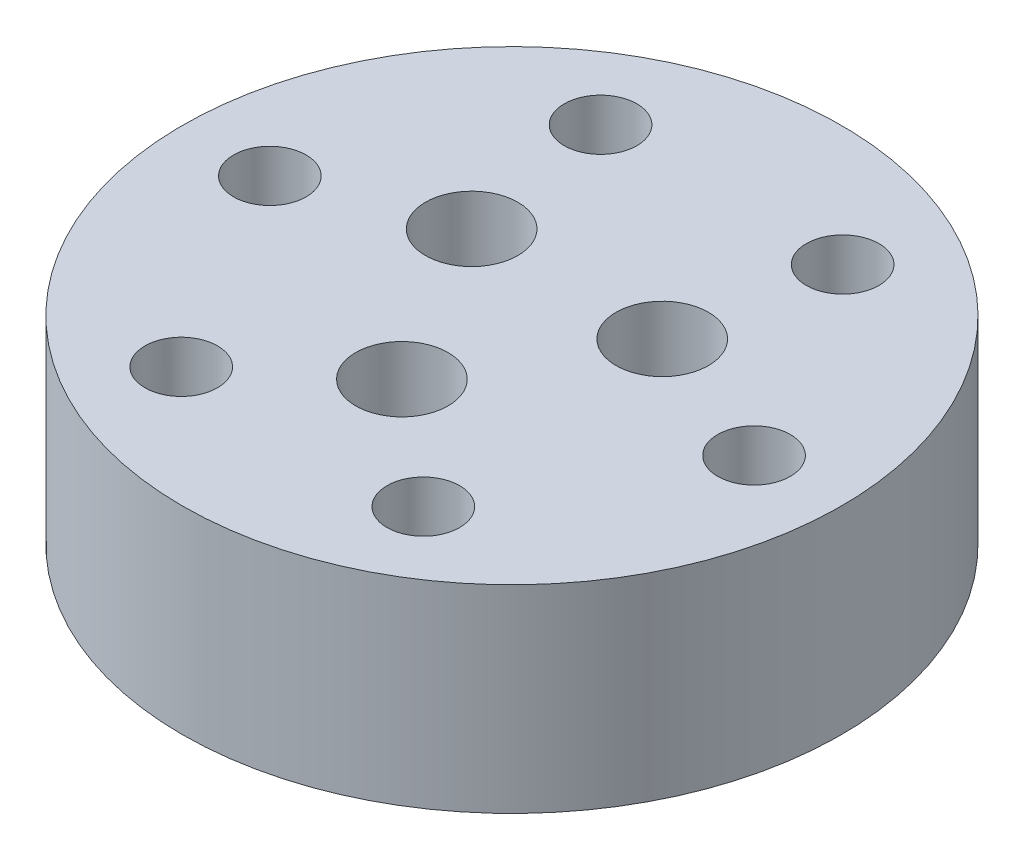
ISO-10303-21;
HEADER;
FILE_DESCRIPTION(('STEP AP214'),'2;1');
FILE_NAME('part.step','',(''),(''),'','','');
FILE_SCHEMA(('AUTOMOTIVE_DESIGN { 1 0 10303 214 1 1 1 1 }'));
ENDSEC;
DATA;
#1=APPLICATION_CONTEXT('core data for automotive mechanical design processes');
#2=APPLICATION_PROTOCOL_DEFINITION('international standard','automotive_design',2000,#1);
#3=PRODUCT_CONTEXT('',#1,'mechanical');
#4=PRODUCT('Part','Part','',(#3));
#5=PRODUCT_RELATED_PRODUCT_CATEGORY('part','',(#4));
#6=PRODUCT_DEFINITION_FORMATION('','',#4);
#7=PRODUCT_DEFINITION_CONTEXT('part definition',#1,'design');
#8=PRODUCT_DEFINITION('design','',#6,#7);
#9=PRODUCT_DEFINITION_SHAPE('','',#8);
#10=(LENGTH_UNIT() NAMED_UNIT(*) SI_UNIT(.MILLI.,.METRE.));
#11=(NAMED_UNIT(*) PLANE_ANGLE_UNIT() SI_UNIT($,.RADIAN.));
#12=(NAMED_UNIT(*) SI_UNIT($,.STERADIAN.) SOLID_ANGLE_UNIT());
#13=UNCERTAINTY_MEASURE_WITH_UNIT(LENGTH_MEASURE(1.E-05),#10,'distance_accuracy_value','');
#14=(GEOMETRIC_REPRESENTATION_CONTEXT(3) GLOBAL_UNCERTAINTY_ASSIGNED_CONTEXT((#13)) GLOBAL_UNIT_ASSIGNED_CONTEXT((#10,
#11,#12)) REPRESENTATION_CONTEXT('',''));
#15=CARTESIAN_POINT('',(0.,0.,0.));
#16=DIRECTION('',(0.,0.,1.));
#17=DIRECTION('',(1.,0.,0.));
#18=AXIS2_PLACEMENT_3D('',#15,#16,#17);
#19=CARTESIAN_POINT('',(-4.33012701892219,9.,-2.5));
#20=DIRECTION('',(0.,-1.,0.));
#21=DIRECTION('',(0.,0.,-1.));
#22=AXIS2_PLACEMENT_3D('',#19,#20,#21);
#23=CYLINDRICAL_SURFACE('',#22,2.1);
#24=CARTESIAN_POINT('',(-4.33012701892219,9.,-2.5));
#25=DIRECTION('',(0.,-1.,0.));
#26=DIRECTION('',(0.,0.,-1.));
#27=AXIS2_PLACEMENT_3D('',#24,#25,#26);
#28=CIRCLE('',#27,2.1);
#29=CARTESIAN_POINT('',(-4.33012701892219,9.,-4.6));
#30=VERTEX_POINT('',#29);
#31=EDGE_CURVE('E76',#30,#30,#28,.T.);
#32=ORIENTED_EDGE('',*,*,#31,.F.);
#33=EDGE_LOOP('',(#32));
#34=FACE_BOUND('',#33,.T.);
#35=CARTESIAN_POINT('',(-4.33012701892219,4.,-2.5));
#36=DIRECTION('',(0.,-1.,0.));
#37=DIRECTION('',(0.,0.,-1.));
#38=AXIS2_PLACEMENT_3D('',#35,#36,#37);
#39=CIRCLE('',#38,2.1);
#40=CARTESIAN_POINT('',(-4.33012701892219,4.,-4.6));
#41=VERTEX_POINT('',#40);
#42=EDGE_CURVE('E46',#41,#41,#39,.F.);
#43=ORIENTED_EDGE('',*,*,#42,.F.);
#44=EDGE_LOOP('',(#43));
#45=FACE_BOUND('',#44,.T.);
#46=ADVANCED_FACE('F42',(#34,#45),#23,.F.);
#47=CARTESIAN_POINT('',(4.33012701892219,9.,-2.5));
#48=DIRECTION('',(0.,-1.,0.));
#49=DIRECTION('',(0.,0.,-1.));
#50=AXIS2_PLACEMENT_3D('',#47,#48,#49);
#51=CYLINDRICAL_SURFACE('',#50,2.1);
#52=CARTESIAN_POINT('',(4.33012701892219,9.,-2.5));
#53=DIRECTION('',(0.,-1.,0.));
#54=DIRECTION('',(0.,0.,-1.));
#55=AXIS2_PLACEMENT_3D('',#52,#53,#54);
#56=CIRCLE('',#55,2.1);
#57=CARTESIAN_POINT('',(4.33012701892219,9.,-4.6));
#58=VERTEX_POINT('',#57);
#59=EDGE_CURVE('E82',#58,#58,#56,.T.);
#60=ORIENTED_EDGE('',*,*,#59,.F.);
#61=EDGE_LOOP('',(#60));
#62=FACE_BOUND('',#61,.T.);
#63=CARTESIAN_POINT('',(4.33012701892219,4.,-2.5));
#64=DIRECTION('',(0.,-1.,0.));
#65=DIRECTION('',(0.,0.,-1.));
#66=AXIS2_PLACEMENT_3D('',#63,#64,#65);
#67=CIRCLE('',#66,2.1);
#68=CARTESIAN_POINT('',(4.33012701892219,4.,-4.6));
#69=VERTEX_POINT('',#68);
#70=EDGE_CURVE('E67',#69,#69,#67,.F.);
#71=ORIENTED_EDGE('',*,*,#70,.F.);
#72=EDGE_LOOP('',(#71));
#73=FACE_BOUND('',#72,.T.);
#74=ADVANCED_FACE('F176',(#62,#73),#51,.F.);
#75=CARTESIAN_POINT('',(0.,9.,5.));
#76=DIRECTION('',(0.,-1.,0.));
#77=DIRECTION('',(0.,0.,-1.));
#78=AXIS2_PLACEMENT_3D('',#75,#76,#77);
#79=CYLINDRICAL_SURFACE('',#78,2.1);
#80=CARTESIAN_POINT('',(0.,9.,5.));
#81=DIRECTION('',(0.,-1.,0.));
#82=DIRECTION('',(0.,0.,-1.));
#83=AXIS2_PLACEMENT_3D('',#80,#81,#82);
#84=CIRCLE('',#83,2.1);
#85=CARTESIAN_POINT('',(0.,9.,2.9));
#86=VERTEX_POINT('',#85);
#87=EDGE_CURVE('E90',#86,#86,#84,.T.);
#88=ORIENTED_EDGE('',*,*,#87,.F.);
#89=EDGE_LOOP('',(#88));
#90=FACE_BOUND('',#89,.T.);
#91=CARTESIAN_POINT('',(0.,4.,5.));
#92=DIRECTION('',(0.,-1.,0.));
#93=DIRECTION('',(0.,0.,-1.));
#94=AXIS2_PLACEMENT_3D('',#91,#92,#93);
#95=CIRCLE('',#94,2.1);
#96=CARTESIAN_POINT('',(0.,4.,2.9));
#97=VERTEX_POINT('',#96);
#98=EDGE_CURVE('E64',#97,#97,#95,.F.);
#99=ORIENTED_EDGE('',*,*,#98,.F.);
#100=EDGE_LOOP('',(#99));
#101=FACE_BOUND('',#100,.T.);
#102=ADVANCED_FACE('F171',(#90,#101),#79,.F.);
#103=CARTESIAN_POINT('',(0.,9.,0.));
#104=DIRECTION('',(0.,-1.,0.));
#105=DIRECTION('',(0.,0.,-1.));
#106=AXIS2_PLACEMENT_3D('',#103,#104,#105);
#107=CYLINDRICAL_SURFACE('',#106,14.975);
#108=CARTESIAN_POINT('',(0.,9.,0.));
#109=DIRECTION('',(0.,1.,0.));
#110=DIRECTION('',(0.,0.,1.));
#111=AXIS2_PLACEMENT_3D('',#108,#109,#110);
#112=CIRCLE('',#111,14.975);
#113=CARTESIAN_POINT('',(0.,9.,14.975));
#114=VERTEX_POINT('',#113);
#115=EDGE_CURVE('E10',#114,#114,#112,.T.);
#116=ORIENTED_EDGE('',*,*,#115,.F.);
#117=EDGE_LOOP('',(#116));
#118=FACE_BOUND('',#117,.T.);
#119=CARTESIAN_POINT('',(0.,0.,0.));
#120=DIRECTION('',(0.,1.,0.));
#121=DIRECTION('',(0.,0.,1.));
#122=AXIS2_PLACEMENT_3D('',#119,#120,#121);
#123=CIRCLE('',#122,14.975);
#124=CARTESIAN_POINT('',(0.,0.,14.975));
#125=VERTEX_POINT('',#124);
#126=EDGE_CURVE('E51',#125,#125,#123,.T.);
#127=ORIENTED_EDGE('',*,*,#126,.T.);
#128=EDGE_LOOP('',(#127));
#129=FACE_BOUND('',#128,.T.);
#130=ADVANCED_FACE('F44',(#118,#129),#107,.T.);
#131=CARTESIAN_POINT('',(0.,9.,0.));
#132=DIRECTION('',(0.,1.,0.));
#133=DIRECTION('',(0.,0.,1.));
#134=AXIS2_PLACEMENT_3D('',#131,#132,#133);
#135=PLANE('',#134);
#136=ORIENTED_EDGE('',*,*,#87,.T.);
#137=EDGE_LOOP('',(#136));
#138=FACE_BOUND('',#137,.T.);
#139=ORIENTED_EDGE('',*,*,#59,.T.);
#140=EDGE_LOOP('',(#139));
#141=FACE_BOUND('',#140,.T.);
#142=ORIENTED_EDGE('',*,*,#31,.T.);
#143=EDGE_LOOP('',(#142));
#144=FACE_BOUND('',#143,.T.);
#145=CARTESIAN_POINT('',(-11.,9.,0.));
#146=DIRECTION('',(0.,1.,0.));
#147=DIRECTION('',(0.,0.,1.));
#148=AXIS2_PLACEMENT_3D('',#145,#146,#147);
#149=CIRCLE('',#148,1.65);
#150=CARTESIAN_POINT('',(-11.,9.,1.65));
#151=VERTEX_POINT('',#150);
#152=EDGE_CURVE('E59',#151,#151,#149,.T.);
#153=ORIENTED_EDGE('',*,*,#152,.F.);
#154=EDGE_LOOP('',(#153));
#155=FACE_BOUND('',#154,.T.);
#156=CARTESIAN_POINT('',(5.50000000000001,9.,-9.52627944162882));
#157=DIRECTION('',(0.,1.,0.));
#158=DIRECTION('',(0.,0.,1.));
#159=AXIS2_PLACEMENT_3D('',#156,#157,#158);
#160=CIRCLE('',#159,1.65);
#161=CARTESIAN_POINT('',(5.50000000000001,9.,-7.87627944162882));
#162=VERTEX_POINT('',#161);
#163=EDGE_CURVE('E131',#162,#162,#160,.T.);
#164=ORIENTED_EDGE('',*,*,#163,.F.);
#165=EDGE_LOOP('',(#164));
#166=FACE_BOUND('',#165,.T.);
#167=CARTESIAN_POINT('',(11.,9.,0.));
#168=DIRECTION('',(0.,1.,0.));
#169=DIRECTION('',(0.,0.,1.));
#170=AXIS2_PLACEMENT_3D('',#167,#168,#169);
#171=CIRCLE('',#170,1.65);
#172=CARTESIAN_POINT('',(11.,9.,1.65));
#173=VERTEX_POINT('',#172);
#174=EDGE_CURVE('E128',#173,#173,#171,.T.);
#175=ORIENTED_EDGE('',*,*,#174,.F.);
#176=EDGE_LOOP('',(#175));
#177=FACE_BOUND('',#176,.T.);
#178=CARTESIAN_POINT('',(5.5,9.,9.52627944162883));
#179=DIRECTION('',(0.,1.,0.));
#180=DIRECTION('',(0.,0.,1.));
#181=AXIS2_PLACEMENT_3D('',#178,#179,#180);
#182=CIRCLE('',#181,1.65);
#183=CARTESIAN_POINT('',(5.5,9.,11.1762794416288));
#184=VERTEX_POINT('',#183);
#185=EDGE_CURVE('E124',#184,#184,#182,.T.);
#186=ORIENTED_EDGE('',*,*,#185,.F.);
#187=EDGE_LOOP('',(#186));
#188=FACE_BOUND('',#187,.T.);
#189=CARTESIAN_POINT('',(-5.5,9.,9.52627944162882));
#190=DIRECTION('',(0.,1.,0.));
#191=DIRECTION('',(0.,0.,1.));
#192=AXIS2_PLACEMENT_3D('',#189,#190,#191);
#193=CIRCLE('',#192,1.65);
#194=CARTESIAN_POINT('',(-5.5,9.,11.1762794416288));
#195=VERTEX_POINT('',#194);
#196=EDGE_CURVE('E121',#195,#195,#193,.T.);
#197=ORIENTED_EDGE('',*,*,#196,.F.);
#198=EDGE_LOOP('',(#197));
#199=FACE_BOUND('',#198,.T.);
#200=CARTESIAN_POINT('',(-5.49999999999999,9.,-9.52627944162883));
#201=DIRECTION('',(0.,1.,0.));
#202=DIRECTION('',(0.,0.,1.));
#203=AXIS2_PLACEMENT_3D('',#200,#201,#202);
#204=CIRCLE('',#203,1.65);
#205=CARTESIAN_POINT('',(-5.49999999999999,9.,-7.87627944162883));
#206=VERTEX_POINT('',#205);
#207=EDGE_CURVE('E98',#206,#206,#204,.T.);
#208=ORIENTED_EDGE('',*,*,#207,.F.);
#209=EDGE_LOOP('',(#208));
#210=FACE_BOUND('',#209,.T.);
#211=ORIENTED_EDGE('',*,*,#115,.T.);
#212=EDGE_LOOP('',(#211));
#213=FACE_BOUND('',#212,.T.);
#214=ADVANCED_FACE('F143',(#138,#141,#144,#155,#166,#177,#188,#199,#210,#213),#135,.T.);
#215=CARTESIAN_POINT('',(0.,0.,0.));
#216=DIRECTION('',(0.,1.,0.));
#217=DIRECTION('',(0.,0.,1.));
#218=AXIS2_PLACEMENT_3D('',#215,#216,#217);
#219=PLANE('',#218);
#220=CARTESIAN_POINT('',(0.,0.,5.));
#221=DIRECTION('',(0.,-1.,0.));
#222=DIRECTION('',(0.,0.,-1.));
#223=AXIS2_PLACEMENT_3D('',#220,#221,#222);
#224=CIRCLE('',#223,3.65);
#225=CARTESIAN_POINT('',(0.,0.,1.35));
#226=VERTEX_POINT('',#225);
#227=EDGE_CURVE('E403',#226,#226,#224,.T.);
#228=ORIENTED_EDGE('',*,*,#227,.F.);
#229=EDGE_LOOP('',(#228));
#230=FACE_BOUND('',#229,.T.);
#231=CARTESIAN_POINT('',(-4.33012701892219,0.,-2.5));
#232=DIRECTION('',(0.,-1.,0.));
#233=DIRECTION('',(0.,0.,-1.));
#234=AXIS2_PLACEMENT_3D('',#231,#232,#233);
#235=CIRCLE('',#234,3.65);
#236=CARTESIAN_POINT('',(-4.33012701892219,0.,-6.15));
#237=VERTEX_POINT('',#236);
#238=EDGE_CURVE('E401',#237,#237,#235,.T.);
#239=ORIENTED_EDGE('',*,*,#238,.F.);
#240=EDGE_LOOP('',(#239));
#241=FACE_BOUND('',#240,.T.);
#242=CARTESIAN_POINT('',(4.33012701892219,0.,-2.5));
#243=DIRECTION('',(0.,-1.,0.));
#244=DIRECTION('',(0.,0.,-1.));
#245=AXIS2_PLACEMENT_3D('',#242,#243,#244);
#246=CIRCLE('',#245,3.65);
#247=CARTESIAN_POINT('',(4.33012701892219,0.,-6.15));
#248=VERTEX_POINT('',#247);
#249=EDGE_CURVE('E409',#248,#248,#246,.T.);
#250=ORIENTED_EDGE('',*,*,#249,.F.);
#251=EDGE_LOOP('',(#250));
#252=FACE_BOUND('',#251,.T.);
#253=CARTESIAN_POINT('',(-11.,0.,0.));
#254=DIRECTION('',(0.,-1.,0.));
#255=DIRECTION('',(0.,0.,-1.));
#256=AXIS2_PLACEMENT_3D('',#253,#254,#255);
#257=CIRCLE('',#256,1.65);
#258=CARTESIAN_POINT('',(-11.,0.,-1.65));
#259=VERTEX_POINT('',#258);
#260=EDGE_CURVE('E94',#259,#259,#257,.T.);
#261=ORIENTED_EDGE('',*,*,#260,.F.);
#262=EDGE_LOOP('',(#261));
#263=FACE_BOUND('',#262,.T.);
#264=CARTESIAN_POINT('',(5.50000000000001,0.,-9.52627944162882));
#265=DIRECTION('',(0.,-1.,0.));
#266=DIRECTION('',(0.,0.,-1.));
#267=AXIS2_PLACEMENT_3D('',#264,#265,#266);
#268=CIRCLE('',#267,1.65);
#269=CARTESIAN_POINT('',(5.50000000000001,0.,-11.1762794416288));
#270=VERTEX_POINT('',#269);
#271=EDGE_CURVE('E100',#270,#270,#268,.T.);
#272=ORIENTED_EDGE('',*,*,#271,.F.);
#273=EDGE_LOOP('',(#272));
#274=FACE_BOUND('',#273,.T.);
#275=CARTESIAN_POINT('',(11.,0.,0.));
#276=DIRECTION('',(0.,-1.,0.));
#277=DIRECTION('',(0.,0.,-1.));
#278=AXIS2_PLACEMENT_3D('',#275,#276,#277);
#279=CIRCLE('',#278,1.65);
#280=CARTESIAN_POINT('',(11.,0.,-1.65));
#281=VERTEX_POINT('',#280);
#282=EDGE_CURVE('E104',#281,#281,#279,.T.);
#283=ORIENTED_EDGE('',*,*,#282,.F.);
#284=EDGE_LOOP('',(#283));
#285=FACE_BOUND('',#284,.T.);
#286=CARTESIAN_POINT('',(5.5,0.,9.52627944162883));
#287=DIRECTION('',(0.,-1.,0.));
#288=DIRECTION('',(0.,0.,-1.));
#289=AXIS2_PLACEMENT_3D('',#286,#287,#288);
#290=CIRCLE('',#289,1.65);
#291=CARTESIAN_POINT('',(5.5,0.,7.87627944162883));
#292=VERTEX_POINT('',#291);
#293=EDGE_CURVE('E111',#292,#292,#290,.T.);
#294=ORIENTED_EDGE('',*,*,#293,.F.);
#295=EDGE_LOOP('',(#294));
#296=FACE_BOUND('',#295,.T.);
#297=CARTESIAN_POINT('',(-5.5,0.,9.52627944162882));
#298=DIRECTION('',(0.,-1.,0.));
#299=DIRECTION('',(0.,0.,-1.));
#300=AXIS2_PLACEMENT_3D('',#297,#298,#299);
#301=CIRCLE('',#300,1.65);
#302=CARTESIAN_POINT('',(-5.5,0.,7.87627944162882));
#303=VERTEX_POINT('',#302);
#304=EDGE_CURVE('E108',#303,#303,#301,.T.);
#305=ORIENTED_EDGE('',*,*,#304,.F.);
#306=EDGE_LOOP('',(#305));
#307=FACE_BOUND('',#306,.T.);
#308=CARTESIAN_POINT('',(-5.49999999999999,0.,-9.52627944162883));
#309=DIRECTION('',(0.,-1.,0.));
#310=DIRECTION('',(0.,0.,-1.));
#311=AXIS2_PLACEMENT_3D('',#308,#309,#310);
#312=CIRCLE('',#311,1.65);
#313=CARTESIAN_POINT('',(-5.49999999999999,0.,-11.1762794416288));
#314=VERTEX_POINT('',#313);
#315=EDGE_CURVE('E99',#314,#314,#312,.T.);
#316=ORIENTED_EDGE('',*,*,#315,.F.);
#317=EDGE_LOOP('',(#316));
#318=FACE_BOUND('',#317,.T.);
#319=ORIENTED_EDGE('',*,*,#126,.F.);
#320=EDGE_LOOP('',(#319));
#321=FACE_BOUND('',#320,.T.);
#322=ADVANCED_FACE('F146',(#230,#241,#252,#263,#274,#285,#296,#307,#318,#321),#219,.F.);
#323=CARTESIAN_POINT('',(-5.49999999999999,10.,-9.52627944162883));
#324=DIRECTION('',(0.,-1.,0.));
#325=DIRECTION('',(0.,0.,-1.));
#326=AXIS2_PLACEMENT_3D('',#323,#324,#325);
#327=CYLINDRICAL_SURFACE('',#326,1.65);
#328=ORIENTED_EDGE('',*,*,#207,.T.);
#329=EDGE_LOOP('',(#328));
#330=FACE_BOUND('',#329,.T.);
#331=ORIENTED_EDGE('',*,*,#315,.T.);
#332=EDGE_LOOP('',(#331));
#333=FACE_BOUND('',#332,.T.);
#334=ADVANCED_FACE('F158',(#330,#333),#327,.F.);
#335=CARTESIAN_POINT('',(-5.5,10.,9.52627944162882));
#336=DIRECTION('',(0.,-1.,0.));
#337=DIRECTION('',(0.,0.,-1.));
#338=AXIS2_PLACEMENT_3D('',#335,#336,#337);
#339=CYLINDRICAL_SURFACE('',#338,1.65);
#340=ORIENTED_EDGE('',*,*,#196,.T.);
#341=EDGE_LOOP('',(#340));
#342=FACE_BOUND('',#341,.T.);
#343=ORIENTED_EDGE('',*,*,#304,.T.);
#344=EDGE_LOOP('',(#343));
#345=FACE_BOUND('',#344,.T.);
#346=ADVANCED_FACE('F161',(#342,#345),#339,.F.);
#347=CARTESIAN_POINT('',(5.5,10.,9.52627944162883));
#348=DIRECTION('',(0.,-1.,0.));
#349=DIRECTION('',(0.,0.,-1.));
#350=AXIS2_PLACEMENT_3D('',#347,#348,#349);
#351=CYLINDRICAL_SURFACE('',#350,1.65);
#352=ORIENTED_EDGE('',*,*,#185,.T.);
#353=EDGE_LOOP('',(#352));
#354=FACE_BOUND('',#353,.T.);
#355=ORIENTED_EDGE('',*,*,#293,.T.);
#356=EDGE_LOOP('',(#355));
#357=FACE_BOUND('',#356,.T.);
#358=ADVANCED_FACE('F198',(#354,#357),#351,.F.);
#359=CARTESIAN_POINT('',(11.,10.,0.));
#360=DIRECTION('',(0.,-1.,0.));
#361=DIRECTION('',(0.,0.,-1.));
#362=AXIS2_PLACEMENT_3D('',#359,#360,#361);
#363=CYLINDRICAL_SURFACE('',#362,1.65);
#364=ORIENTED_EDGE('',*,*,#174,.T.);
#365=EDGE_LOOP('',(#364));
#366=FACE_BOUND('',#365,.T.);
#367=ORIENTED_EDGE('',*,*,#282,.T.);
#368=EDGE_LOOP('',(#367));
#369=FACE_BOUND('',#368,.T.);
#370=ADVANCED_FACE('F194',(#366,#369),#363,.F.);
#371=CARTESIAN_POINT('',(5.50000000000001,10.,-9.52627944162882));
#372=DIRECTION('',(0.,-1.,0.));
#373=DIRECTION('',(0.,0.,-1.));
#374=AXIS2_PLACEMENT_3D('',#371,#372,#373);
#375=CYLINDRICAL_SURFACE('',#374,1.65);
#376=ORIENTED_EDGE('',*,*,#163,.T.);
#377=EDGE_LOOP('',(#376));
#378=FACE_BOUND('',#377,.T.);
#379=ORIENTED_EDGE('',*,*,#271,.T.);
#380=EDGE_LOOP('',(#379));
#381=FACE_BOUND('',#380,.T.);
#382=ADVANCED_FACE('F192',(#378,#381),#375,.F.);
#383=CARTESIAN_POINT('',(-11.,10.,0.));
#384=DIRECTION('',(0.,-1.,0.));
#385=DIRECTION('',(0.,0.,-1.));
#386=AXIS2_PLACEMENT_3D('',#383,#384,#385);
#387=CYLINDRICAL_SURFACE('',#386,1.65);
#388=ORIENTED_EDGE('',*,*,#152,.T.);
#389=EDGE_LOOP('',(#388));
#390=FACE_BOUND('',#389,.T.);
#391=ORIENTED_EDGE('',*,*,#260,.T.);
#392=EDGE_LOOP('',(#391));
#393=FACE_BOUND('',#392,.T.);
#394=ADVANCED_FACE('F140',(#390,#393),#387,.F.);
#395=CARTESIAN_POINT('',(0.,4.,5.));
#396=DIRECTION('',(0.,-1.,0.));
#397=DIRECTION('',(0.,0.,-1.));
#398=AXIS2_PLACEMENT_3D('',#395,#396,#397);
#399=PLANE('',#398);
#400=CARTESIAN_POINT('',(0.,4.,5.));
#401=DIRECTION('',(0.,-1.,0.));
#402=DIRECTION('',(0.,0.,-1.));
#403=AXIS2_PLACEMENT_3D('',#400,#401,#402);
#404=CIRCLE('',#403,3.65);
#405=CARTESIAN_POINT('',(0.,4.,1.35));
#406=VERTEX_POINT('',#405);
#407=EDGE_CURVE('E68',#406,#406,#404,.T.);
#408=ORIENTED_EDGE('',*,*,#407,.T.);
#409=EDGE_LOOP('',(#408));
#410=FACE_BOUND('',#409,.T.);
#411=ORIENTED_EDGE('',*,*,#98,.T.);
#412=EDGE_LOOP('',(#411));
#413=FACE_BOUND('',#412,.T.);
#414=ADVANCED_FACE('F191',(#410,#413),#399,.T.);
#415=CARTESIAN_POINT('',(0.,4.,5.));
#416=DIRECTION('',(0.,-1.,0.));
#417=DIRECTION('',(0.,0.,-1.));
#418=AXIS2_PLACEMENT_3D('',#415,#416,#417);
#419=CYLINDRICAL_SURFACE('',#418,3.65);
#420=ORIENTED_EDGE('',*,*,#407,.F.);
#421=EDGE_LOOP('',(#420));
#422=FACE_BOUND('',#421,.T.);
#423=ORIENTED_EDGE('',*,*,#227,.T.);
#424=EDGE_LOOP('',(#423));
#425=FACE_BOUND('',#424,.T.);
#426=ADVANCED_FACE('F229',(#422,#425),#419,.F.);
#427=CARTESIAN_POINT('',(4.33012701892219,4.,-2.5));
#428=DIRECTION('',(0.,-1.,0.));
#429=DIRECTION('',(0.,0.,-1.));
#430=AXIS2_PLACEMENT_3D('',#427,#428,#429);
#431=PLANE('',#430);
#432=CARTESIAN_POINT('',(4.33012701892219,4.,-2.5));
#433=DIRECTION('',(0.,-1.,0.));
#434=DIRECTION('',(0.,0.,-1.));
#435=AXIS2_PLACEMENT_3D('',#432,#433,#434);
#436=CIRCLE('',#435,3.65);
#437=CARTESIAN_POINT('',(4.33012701892219,4.,-6.15));
#438=VERTEX_POINT('',#437);
#439=EDGE_CURVE('E415',#438,#438,#436,.T.);
#440=ORIENTED_EDGE('',*,*,#439,.T.);
#441=EDGE_LOOP('',(#440));
#442=FACE_BOUND('',#441,.T.);
#443=ORIENTED_EDGE('',*,*,#70,.T.);
#444=EDGE_LOOP('',(#443));
#445=FACE_BOUND('',#444,.T.);
#446=ADVANCED_FACE('F236',(#442,#445),#431,.T.);
#447=CARTESIAN_POINT('',(4.33012701892219,4.,-2.5));
#448=DIRECTION('',(0.,-1.,0.));
#449=DIRECTION('',(0.,0.,-1.));
#450=AXIS2_PLACEMENT_3D('',#447,#448,#449);
#451=CYLINDRICAL_SURFACE('',#450,3.65);
#452=ORIENTED_EDGE('',*,*,#439,.F.);
#453=EDGE_LOOP('',(#452));
#454=FACE_BOUND('',#453,.T.);
#455=ORIENTED_EDGE('',*,*,#249,.T.);
#456=EDGE_LOOP('',(#455));
#457=FACE_BOUND('',#456,.T.);
#458=ADVANCED_FACE('F243',(#454,#457),#451,.F.);
#459=CARTESIAN_POINT('',(-4.33012701892219,4.,-2.5));
#460=DIRECTION('',(0.,-1.,0.));
#461=DIRECTION('',(0.,0.,-1.));
#462=AXIS2_PLACEMENT_3D('',#459,#460,#461);
#463=PLANE('',#462);
#464=CARTESIAN_POINT('',(-4.33012701892219,4.,-2.5));
#465=DIRECTION('',(0.,-1.,0.));
#466=DIRECTION('',(0.,0.,-1.));
#467=AXIS2_PLACEMENT_3D('',#464,#465,#466);
#468=CIRCLE('',#467,3.65);
#469=CARTESIAN_POINT('',(-4.33012701892219,4.,-6.15));
#470=VERTEX_POINT('',#469);
#471=EDGE_CURVE('E398',#470,#470,#468,.T.);
#472=ORIENTED_EDGE('',*,*,#471,.T.);
#473=EDGE_LOOP('',(#472));
#474=FACE_BOUND('',#473,.T.);
#475=ORIENTED_EDGE('',*,*,#42,.T.);
#476=EDGE_LOOP('',(#475));
#477=FACE_BOUND('',#476,.T.);
#478=ADVANCED_FACE('F250',(#474,#477),#463,.T.);
#479=CARTESIAN_POINT('',(-4.33012701892219,4.,-2.5));
#480=DIRECTION('',(0.,-1.,0.));
#481=DIRECTION('',(0.,0.,-1.));
#482=AXIS2_PLACEMENT_3D('',#479,#480,#481);
#483=CYLINDRICAL_SURFACE('',#482,3.65);
#484=ORIENTED_EDGE('',*,*,#471,.F.);
#485=EDGE_LOOP('',(#484));
#486=FACE_BOUND('',#485,.T.);
#487=ORIENTED_EDGE('',*,*,#238,.T.);
#488=EDGE_LOOP('',(#487));
#489=FACE_BOUND('',#488,.T.);
#490=ADVANCED_FACE('F257',(#486,#489),#483,.F.);
#491=CLOSED_SHELL('',(#46,#74,#102,#130,#214,#322,#334,#346,#358,#370,#382,#394,#414,#426,#446,
#458,#478,#490));
#492=MANIFOLD_SOLID_BREP('B2',#491);
#493=ADVANCED_BREP_SHAPE_REPRESENTATION('',(#18,#492),#14);
#494=SHAPE_DEFINITION_REPRESENTATION(#9,#493);
ENDSEC;
END-ISO-10303-21;
